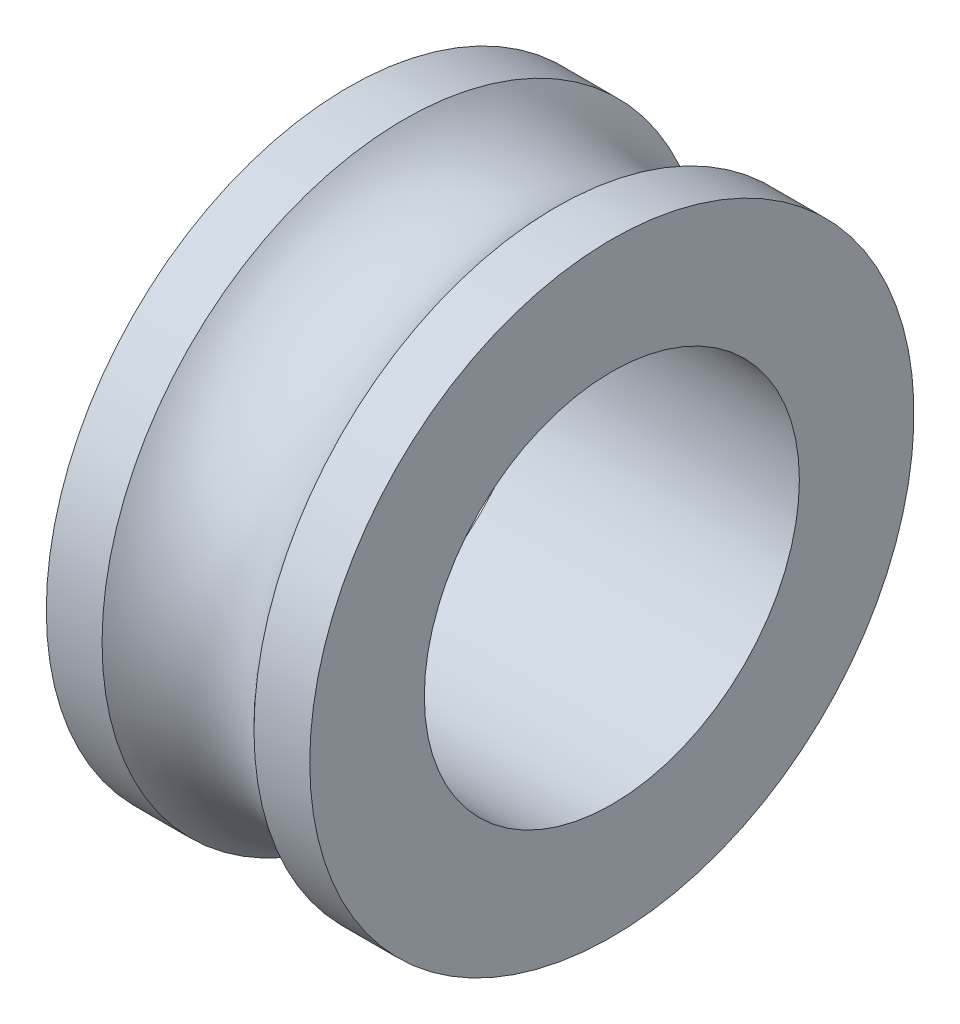
ISO-10303-21;
HEADER;
FILE_DESCRIPTION(('STEP AP214'),'2;1');
FILE_NAME('part.step','',(''),(''),'','','');
FILE_SCHEMA(('AUTOMOTIVE_DESIGN { 1 0 10303 214 1 1 1 1 }'));
ENDSEC;
DATA;
#1=APPLICATION_CONTEXT('core data for automotive mechanical design processes');
#2=APPLICATION_PROTOCOL_DEFINITION('international standard','automotive_design',2000,#1);
#3=PRODUCT_CONTEXT('',#1,'mechanical');
#4=PRODUCT('Part','Part','',(#3));
#5=PRODUCT_RELATED_PRODUCT_CATEGORY('part','',(#4));
#6=PRODUCT_DEFINITION_FORMATION('','',#4);
#7=PRODUCT_DEFINITION_CONTEXT('part definition',#1,'design');
#8=PRODUCT_DEFINITION('design','',#6,#7);
#9=PRODUCT_DEFINITION_SHAPE('','',#8);
#10=(LENGTH_UNIT() NAMED_UNIT(*) SI_UNIT(.MILLI.,.METRE.));
#11=(NAMED_UNIT(*) PLANE_ANGLE_UNIT() SI_UNIT($,.RADIAN.));
#12=(NAMED_UNIT(*) SI_UNIT($,.STERADIAN.) SOLID_ANGLE_UNIT());
#13=UNCERTAINTY_MEASURE_WITH_UNIT(LENGTH_MEASURE(1.E-05),#10,'distance_accuracy_value','');
#14=(GEOMETRIC_REPRESENTATION_CONTEXT(3) GLOBAL_UNCERTAINTY_ASSIGNED_CONTEXT((#13)) GLOBAL_UNIT_ASSIGNED_CONTEXT((#10,
#11,#12)) REPRESENTATION_CONTEXT('',''));
#15=CARTESIAN_POINT('',(0.,0.,0.));
#16=DIRECTION('',(0.,0.,1.));
#17=DIRECTION('',(1.,0.,0.));
#18=AXIS2_PLACEMENT_3D('',#15,#16,#17);
#19=CARTESIAN_POINT('',(3.575,8.199,0.));
#20=DIRECTION('',(-1.,0.,0.));
#21=DIRECTION('',(0.,0.,1.));
#22=AXIS2_PLACEMENT_3D('',#19,#20,#21);
#23=PLANE('',#22);
#24=CARTESIAN_POINT('',(3.575,0.,0.));
#25=DIRECTION('',(-1.,0.,0.));
#26=DIRECTION('',(0.,0.,1.));
#27=AXIS2_PLACEMENT_3D('',#24,#25,#26);
#28=CIRCLE('',#27,8.199);
#29=CARTESIAN_POINT('',(3.575,0.,8.199));
#30=VERTEX_POINT('',#29);
#31=EDGE_CURVE('E10',#30,#30,#28,.T.);
#32=ORIENTED_EDGE('',*,*,#31,.F.);
#33=EDGE_LOOP('',(#32));
#34=FACE_BOUND('',#33,.T.);
#35=CARTESIAN_POINT('',(3.575,0.,0.));
#36=DIRECTION('',(-1.,0.,0.));
#37=DIRECTION('',(0.,0.,1.));
#38=AXIS2_PLACEMENT_3D('',#35,#36,#37);
#39=CIRCLE('',#38,5.089);
#40=CARTESIAN_POINT('',(3.575,0.,5.089));
#41=VERTEX_POINT('',#40);
#42=EDGE_CURVE('E53',#41,#41,#39,.T.);
#43=ORIENTED_EDGE('',*,*,#42,.T.);
#44=EDGE_LOOP('',(#43));
#45=FACE_BOUND('',#44,.T.);
#46=ADVANCED_FACE('F31',(#34,#45),#23,.F.);
#47=CARTESIAN_POINT('',(0.,0.,0.));
#48=DIRECTION('',(-1.,0.,0.));
#49=DIRECTION('',(0.,0.,1.));
#50=AXIS2_PLACEMENT_3D('',#47,#48,#49);
#51=CYLINDRICAL_SURFACE('',#50,8.199);
#52=CARTESIAN_POINT('',(2.06164982477626,0.,0.));
#53=DIRECTION('',(-1.,0.,0.));
#54=DIRECTION('',(0.,0.,1.));
#55=AXIS2_PLACEMENT_3D('',#52,#53,#54);
#56=CIRCLE('',#55,8.199);
#57=CARTESIAN_POINT('',(2.06164982477626,0.,8.199));
#58=VERTEX_POINT('',#57);
#59=EDGE_CURVE('E37',#58,#58,#56,.T.);
#60=ORIENTED_EDGE('',*,*,#59,.F.);
#61=EDGE_LOOP('',(#60));
#62=FACE_BOUND('',#61,.T.);
#63=ORIENTED_EDGE('',*,*,#31,.T.);
#64=EDGE_LOOP('',(#63));
#65=FACE_BOUND('',#64,.T.);
#66=ADVANCED_FACE('F78',(#62,#65),#51,.T.);
#67=CARTESIAN_POINT('',(0.,0.,0.));
#68=DIRECTION('',(-1.,0.,0.));
#69=DIRECTION('',(0.,0.,1.));
#70=AXIS2_PLACEMENT_3D('',#67,#68,#69);
#71=TOROIDAL_SURFACE('',#70,10.049,2.77);
#72=CARTESIAN_POINT('',(-2.06164982477626,0.,0.));
#73=DIRECTION('',(-1.,0.,0.));
#74=DIRECTION('',(0.,0.,1.));
#75=AXIS2_PLACEMENT_3D('',#72,#73,#74);
#76=CIRCLE('',#75,8.199);
#77=CARTESIAN_POINT('',(-2.06164982477626,0.,8.199));
#78=VERTEX_POINT('',#77);
#79=EDGE_CURVE('E41',#78,#78,#76,.T.);
#80=ORIENTED_EDGE('',*,*,#79,.F.);
#81=EDGE_LOOP('',(#80));
#82=FACE_BOUND('',#81,.T.);
#83=ORIENTED_EDGE('',*,*,#59,.T.);
#84=EDGE_LOOP('',(#83));
#85=FACE_BOUND('',#84,.T.);
#86=ADVANCED_FACE('F73',(#82,#85),#71,.F.);
#87=CARTESIAN_POINT('',(0.,0.,0.));
#88=DIRECTION('',(-1.,0.,0.));
#89=DIRECTION('',(0.,0.,1.));
#90=AXIS2_PLACEMENT_3D('',#87,#88,#89);
#91=CYLINDRICAL_SURFACE('',#90,8.199);
#92=CARTESIAN_POINT('',(-3.575,0.,0.));
#93=DIRECTION('',(-1.,0.,0.));
#94=DIRECTION('',(0.,0.,1.));
#95=AXIS2_PLACEMENT_3D('',#92,#93,#94);
#96=CIRCLE('',#95,8.199);
#97=CARTESIAN_POINT('',(-3.575,0.,8.199));
#98=VERTEX_POINT('',#97);
#99=EDGE_CURVE('E45',#98,#98,#96,.T.);
#100=ORIENTED_EDGE('',*,*,#99,.F.);
#101=EDGE_LOOP('',(#100));
#102=FACE_BOUND('',#101,.T.);
#103=ORIENTED_EDGE('',*,*,#79,.T.);
#104=EDGE_LOOP('',(#103));
#105=FACE_BOUND('',#104,.T.);
#106=ADVANCED_FACE('F67',(#102,#105),#91,.T.);
#107=CARTESIAN_POINT('',(-3.575,8.199,0.));
#108=DIRECTION('',(1.,0.,0.));
#109=DIRECTION('',(0.,0.,-1.));
#110=AXIS2_PLACEMENT_3D('',#107,#108,#109);
#111=PLANE('',#110);
#112=CARTESIAN_POINT('',(-3.575,0.,0.));
#113=DIRECTION('',(-1.,0.,0.));
#114=DIRECTION('',(0.,0.,1.));
#115=AXIS2_PLACEMENT_3D('',#112,#113,#114);
#116=CIRCLE('',#115,5.089);
#117=CARTESIAN_POINT('',(-3.575,0.,5.089));
#118=VERTEX_POINT('',#117);
#119=EDGE_CURVE('E50',#118,#118,#116,.T.);
#120=ORIENTED_EDGE('',*,*,#119,.F.);
#121=EDGE_LOOP('',(#120));
#122=FACE_BOUND('',#121,.T.);
#123=ORIENTED_EDGE('',*,*,#99,.T.);
#124=EDGE_LOOP('',(#123));
#125=FACE_BOUND('',#124,.T.);
#126=ADVANCED_FACE('F61',(#122,#125),#111,.F.);
#127=CARTESIAN_POINT('',(0.,0.,0.));
#128=DIRECTION('',(-1.,0.,0.));
#129=DIRECTION('',(0.,0.,1.));
#130=AXIS2_PLACEMENT_3D('',#127,#128,#129);
#131=CYLINDRICAL_SURFACE('',#130,5.089);
#132=ORIENTED_EDGE('',*,*,#42,.F.);
#133=EDGE_LOOP('',(#132));
#134=FACE_BOUND('',#133,.T.);
#135=ORIENTED_EDGE('',*,*,#119,.T.);
#136=EDGE_LOOP('',(#135));
#137=FACE_BOUND('',#136,.T.);
#138=ADVANCED_FACE('F58',(#134,#137),#131,.F.);
#139=CLOSED_SHELL('',(#46,#66,#86,#106,#126,#138));
#140=MANIFOLD_SOLID_BREP('B2',#139);
#141=ADVANCED_BREP_SHAPE_REPRESENTATION('',(#18,#140),#14);
#142=SHAPE_DEFINITION_REPRESENTATION(#9,#141);
ENDSEC;
END-ISO-10303-21;
